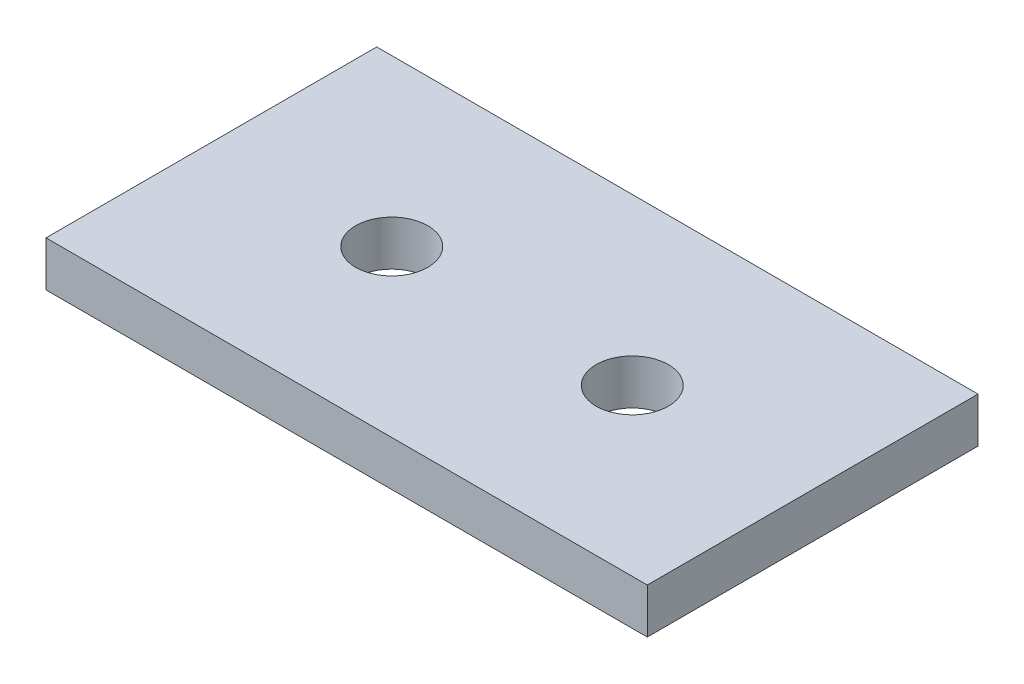
ISO-10303-21;
HEADER;
FILE_DESCRIPTION(('STEP AP214'),'2;1');
FILE_NAME('part.step','',(''),(''),'','','');
FILE_SCHEMA(('AUTOMOTIVE_DESIGN { 1 0 10303 214 1 1 1 1 }'));
ENDSEC;
DATA;
#1=APPLICATION_CONTEXT('core data for automotive mechanical design processes');
#2=APPLICATION_PROTOCOL_DEFINITION('international standard','automotive_design',2000,#1);
#3=PRODUCT_CONTEXT('',#1,'mechanical');
#4=PRODUCT('Part','Part','',(#3));
#5=PRODUCT_RELATED_PRODUCT_CATEGORY('part','',(#4));
#6=PRODUCT_DEFINITION_FORMATION('','',#4);
#7=PRODUCT_DEFINITION_CONTEXT('part definition',#1,'design');
#8=PRODUCT_DEFINITION('design','',#6,#7);
#9=PRODUCT_DEFINITION_SHAPE('','',#8);
#10=(LENGTH_UNIT() NAMED_UNIT(*) SI_UNIT(.MILLI.,.METRE.));
#11=(NAMED_UNIT(*) PLANE_ANGLE_UNIT() SI_UNIT($,.RADIAN.));
#12=(NAMED_UNIT(*) SI_UNIT($,.STERADIAN.) SOLID_ANGLE_UNIT());
#13=UNCERTAINTY_MEASURE_WITH_UNIT(LENGTH_MEASURE(1.E-05),#10,'distance_accuracy_value','');
#14=(GEOMETRIC_REPRESENTATION_CONTEXT(3) GLOBAL_UNCERTAINTY_ASSIGNED_CONTEXT((#13)) GLOBAL_UNIT_ASSIGNED_CONTEXT((#10,
#11,#12)) REPRESENTATION_CONTEXT('',''));
#15=CARTESIAN_POINT('',(0.,0.,0.));
#16=DIRECTION('',(0.,0.,1.));
#17=DIRECTION('',(1.,0.,0.));
#18=AXIS2_PLACEMENT_3D('',#15,#16,#17);
#19=CARTESIAN_POINT('',(-20.,-1.5,5.5));
#20=DIRECTION('',(-1.,0.,0.));
#21=DIRECTION('',(0.,0.,1.));
#22=AXIS2_PLACEMENT_3D('',#19,#20,#21);
#23=PLANE('',#22);
#24=DIRECTION('',(0.,0.,1.));
#25=VECTOR('',#24,1.);
#26=CARTESIAN_POINT('',(-20.,0.,5.5));
#27=LINE('',#26,#25);
#28=CARTESIAN_POINT('',(-20.,0.,-5.5));
#29=VERTEX_POINT('',#28);
#30=CARTESIAN_POINT('',(-20.,0.,5.5));
#31=VERTEX_POINT('',#30);
#32=EDGE_CURVE('E104',#29,#31,#27,.T.);
#33=ORIENTED_EDGE('',*,*,#32,.F.);
#34=DIRECTION('',(0.,1.,0.));
#35=VECTOR('',#34,1.);
#36=CARTESIAN_POINT('',(-20.,-1.5,-5.5));
#37=LINE('',#36,#35);
#38=CARTESIAN_POINT('',(-20.,-1.5,-5.5));
#39=VERTEX_POINT('',#38);
#40=EDGE_CURVE('E11',#39,#29,#37,.T.);
#41=ORIENTED_EDGE('',*,*,#40,.F.);
#42=DIRECTION('',(0.,0.,1.));
#43=VECTOR('',#42,1.);
#44=CARTESIAN_POINT('',(-20.,-1.5,5.5));
#45=LINE('',#44,#43);
#46=CARTESIAN_POINT('',(-20.,-1.5,5.5));
#47=VERTEX_POINT('',#46);
#48=EDGE_CURVE('E97',#39,#47,#45,.T.);
#49=ORIENTED_EDGE('',*,*,#48,.T.);
#50=DIRECTION('',(0.,1.,0.));
#51=VECTOR('',#50,1.);
#52=CARTESIAN_POINT('',(-20.,-1.5,5.5));
#53=LINE('',#52,#51);
#54=EDGE_CURVE('E42',#47,#31,#53,.T.);
#55=ORIENTED_EDGE('',*,*,#54,.T.);
#56=EDGE_LOOP('',(#33,#41,#49,#55));
#57=FACE_BOUND('',#56,.T.);
#58=ADVANCED_FACE('F39',(#57),#23,.T.);
#59=CARTESIAN_POINT('',(-20.,-1.5,-5.5));
#60=DIRECTION('',(0.,0.,-1.));
#61=DIRECTION('',(-1.,0.,0.));
#62=AXIS2_PLACEMENT_3D('',#59,#60,#61);
#63=PLANE('',#62);
#64=DIRECTION('',(-1.,0.,0.));
#65=VECTOR('',#64,1.);
#66=CARTESIAN_POINT('',(-20.,0.,-5.5));
#67=LINE('',#66,#65);
#68=CARTESIAN_POINT('',(0.,0.,-5.5));
#69=VERTEX_POINT('',#68);
#70=EDGE_CURVE('E99',#69,#29,#67,.T.);
#71=ORIENTED_EDGE('',*,*,#70,.F.);
#72=DIRECTION('',(0.,1.,0.));
#73=VECTOR('',#72,1.);
#74=CARTESIAN_POINT('',(0.,-1.5,-5.5));
#75=LINE('',#74,#73);
#76=CARTESIAN_POINT('',(0.,-1.5,-5.5));
#77=VERTEX_POINT('',#76);
#78=EDGE_CURVE('E48',#77,#69,#75,.T.);
#79=ORIENTED_EDGE('',*,*,#78,.F.);
#80=DIRECTION('',(-1.,0.,0.));
#81=VECTOR('',#80,1.);
#82=CARTESIAN_POINT('',(-20.,-1.5,-5.5));
#83=LINE('',#82,#81);
#84=EDGE_CURVE('E94',#77,#39,#83,.T.);
#85=ORIENTED_EDGE('',*,*,#84,.T.);
#86=ORIENTED_EDGE('',*,*,#40,.T.);
#87=EDGE_LOOP('',(#71,#79,#85,#86));
#88=FACE_BOUND('',#87,.T.);
#89=ADVANCED_FACE('F115',(#88),#63,.T.);
#90=CARTESIAN_POINT('',(0.,-1.5,-5.5));
#91=DIRECTION('',(1.,0.,0.));
#92=DIRECTION('',(0.,0.,-1.));
#93=AXIS2_PLACEMENT_3D('',#90,#91,#92);
#94=PLANE('',#93);
#95=DIRECTION('',(0.,0.,-1.));
#96=VECTOR('',#95,1.);
#97=CARTESIAN_POINT('',(0.,0.,-5.5));
#98=LINE('',#97,#96);
#99=CARTESIAN_POINT('',(0.,0.,5.5));
#100=VERTEX_POINT('',#99);
#101=EDGE_CURVE('E89',#100,#69,#98,.T.);
#102=ORIENTED_EDGE('',*,*,#101,.F.);
#103=DIRECTION('',(0.,1.,0.));
#104=VECTOR('',#103,1.);
#105=CARTESIAN_POINT('',(0.,-1.5,5.5));
#106=LINE('',#105,#104);
#107=CARTESIAN_POINT('',(0.,-1.5,5.5));
#108=VERTEX_POINT('',#107);
#109=EDGE_CURVE('E84',#108,#100,#106,.T.);
#110=ORIENTED_EDGE('',*,*,#109,.F.);
#111=DIRECTION('',(0.,0.,-1.));
#112=VECTOR('',#111,1.);
#113=CARTESIAN_POINT('',(0.,-1.5,-5.5));
#114=LINE('',#113,#112);
#115=EDGE_CURVE('E87',#108,#77,#114,.T.);
#116=ORIENTED_EDGE('',*,*,#115,.T.);
#117=ORIENTED_EDGE('',*,*,#78,.T.);
#118=EDGE_LOOP('',(#102,#110,#116,#117));
#119=FACE_BOUND('',#118,.T.);
#120=ADVANCED_FACE('F86',(#119),#94,.T.);
#121=CARTESIAN_POINT('',(0.,-1.5,5.5));
#122=DIRECTION('',(0.,0.,1.));
#123=DIRECTION('',(1.,0.,0.));
#124=AXIS2_PLACEMENT_3D('',#121,#122,#123);
#125=PLANE('',#124);
#126=DIRECTION('',(1.,0.,0.));
#127=VECTOR('',#126,1.);
#128=CARTESIAN_POINT('',(0.,0.,5.5));
#129=LINE('',#128,#127);
#130=EDGE_CURVE('E107',#31,#100,#129,.T.);
#131=ORIENTED_EDGE('',*,*,#130,.F.);
#132=ORIENTED_EDGE('',*,*,#54,.F.);
#133=DIRECTION('',(1.,0.,0.));
#134=VECTOR('',#133,1.);
#135=CARTESIAN_POINT('',(0.,-1.5,5.5));
#136=LINE('',#135,#134);
#137=EDGE_CURVE('E93',#47,#108,#136,.T.);
#138=ORIENTED_EDGE('',*,*,#137,.T.);
#139=ORIENTED_EDGE('',*,*,#109,.T.);
#140=EDGE_LOOP('',(#131,#132,#138,#139));
#141=FACE_BOUND('',#140,.T.);
#142=ADVANCED_FACE('F96',(#141),#125,.T.);
#143=CARTESIAN_POINT('',(0.,-1.5,0.));
#144=DIRECTION('',(0.,-1.,0.));
#145=DIRECTION('',(0.,0.,-1.));
#146=AXIS2_PLACEMENT_3D('',#143,#144,#145);
#147=PLANE('',#146);
#148=CARTESIAN_POINT('',(-6.,-1.5,0.));
#149=DIRECTION('',(0.,1.,0.));
#150=DIRECTION('',(0.,0.,1.));
#151=AXIS2_PLACEMENT_3D('',#148,#149,#150);
#152=CIRCLE('',#151,1.2);
#153=CARTESIAN_POINT('',(-6.,-1.5,1.2));
#154=VERTEX_POINT('',#153);
#155=EDGE_CURVE('E108',#154,#154,#152,.T.);
#156=ORIENTED_EDGE('',*,*,#155,.T.);
#157=EDGE_LOOP('',(#156));
#158=FACE_BOUND('',#157,.T.);
#159=CARTESIAN_POINT('',(-14.,-1.5,0.));
#160=DIRECTION('',(0.,1.,0.));
#161=DIRECTION('',(0.,0.,1.));
#162=AXIS2_PLACEMENT_3D('',#159,#160,#161);
#163=CIRCLE('',#162,1.2);
#164=CARTESIAN_POINT('',(-14.,-1.5,1.2));
#165=VERTEX_POINT('',#164);
#166=EDGE_CURVE('E155',#165,#165,#163,.T.);
#167=ORIENTED_EDGE('',*,*,#166,.T.);
#168=EDGE_LOOP('',(#167));
#169=FACE_BOUND('',#168,.T.);
#170=ORIENTED_EDGE('',*,*,#48,.F.);
#171=ORIENTED_EDGE('',*,*,#84,.F.);
#172=ORIENTED_EDGE('',*,*,#115,.F.);
#173=ORIENTED_EDGE('',*,*,#137,.F.);
#174=EDGE_LOOP('',(#170,#171,#172,#173));
#175=FACE_BOUND('',#174,.T.);
#176=ADVANCED_FACE('F92',(#158,#169,#175),#147,.T.);
#177=CARTESIAN_POINT('',(0.,0.,0.));
#178=DIRECTION('',(0.,-1.,0.));
#179=DIRECTION('',(0.,0.,-1.));
#180=AXIS2_PLACEMENT_3D('',#177,#178,#179);
#181=PLANE('',#180);
#182=CARTESIAN_POINT('',(-6.,0.,0.));
#183=DIRECTION('',(0.,1.,0.));
#184=DIRECTION('',(0.,0.,1.));
#185=AXIS2_PLACEMENT_3D('',#182,#183,#184);
#186=CIRCLE('',#185,1.2);
#187=CARTESIAN_POINT('',(-6.,0.,1.2));
#188=VERTEX_POINT('',#187);
#189=EDGE_CURVE('E150',#188,#188,#186,.T.);
#190=ORIENTED_EDGE('',*,*,#189,.F.);
#191=EDGE_LOOP('',(#190));
#192=FACE_BOUND('',#191,.T.);
#193=CARTESIAN_POINT('',(-14.,0.,0.));
#194=DIRECTION('',(0.,1.,0.));
#195=DIRECTION('',(0.,0.,1.));
#196=AXIS2_PLACEMENT_3D('',#193,#194,#195);
#197=CIRCLE('',#196,1.2);
#198=CARTESIAN_POINT('',(-14.,0.,1.2));
#199=VERTEX_POINT('',#198);
#200=EDGE_CURVE('E151',#199,#199,#197,.T.);
#201=ORIENTED_EDGE('',*,*,#200,.F.);
#202=EDGE_LOOP('',(#201));
#203=FACE_BOUND('',#202,.T.);
#204=ORIENTED_EDGE('',*,*,#32,.T.);
#205=ORIENTED_EDGE('',*,*,#130,.T.);
#206=ORIENTED_EDGE('',*,*,#101,.T.);
#207=ORIENTED_EDGE('',*,*,#70,.T.);
#208=EDGE_LOOP('',(#204,#205,#206,#207));
#209=FACE_BOUND('',#208,.T.);
#210=ADVANCED_FACE('F114',(#192,#203,#209),#181,.F.);
#211=CARTESIAN_POINT('',(-14.,-1.5,0.));
#212=DIRECTION('',(0.,1.,0.));
#213=DIRECTION('',(0.,0.,1.));
#214=AXIS2_PLACEMENT_3D('',#211,#212,#213);
#215=CYLINDRICAL_SURFACE('',#214,1.2);
#216=ORIENTED_EDGE('',*,*,#166,.F.);
#217=EDGE_LOOP('',(#216));
#218=FACE_BOUND('',#217,.T.);
#219=ORIENTED_EDGE('',*,*,#200,.T.);
#220=EDGE_LOOP('',(#219));
#221=FACE_BOUND('',#220,.T.);
#222=ADVANCED_FACE('F133',(#218,#221),#215,.F.);
#223=CARTESIAN_POINT('',(-6.,-1.5,0.));
#224=DIRECTION('',(0.,1.,0.));
#225=DIRECTION('',(0.,0.,1.));
#226=AXIS2_PLACEMENT_3D('',#223,#224,#225);
#227=CYLINDRICAL_SURFACE('',#226,1.2);
#228=ORIENTED_EDGE('',*,*,#155,.F.);
#229=EDGE_LOOP('',(#228));
#230=FACE_BOUND('',#229,.T.);
#231=ORIENTED_EDGE('',*,*,#189,.T.);
#232=EDGE_LOOP('',(#231));
#233=FACE_BOUND('',#232,.T.);
#234=ADVANCED_FACE('F140',(#230,#233),#227,.F.);
#235=CLOSED_SHELL('',(#58,#89,#120,#142,#176,#210,#222,#234));
#236=MANIFOLD_SOLID_BREP('B2',#235);
#237=ADVANCED_BREP_SHAPE_REPRESENTATION('',(#18,#236),#14);
#238=SHAPE_DEFINITION_REPRESENTATION(#9,#237);
ENDSEC;
END-ISO-10303-21;
